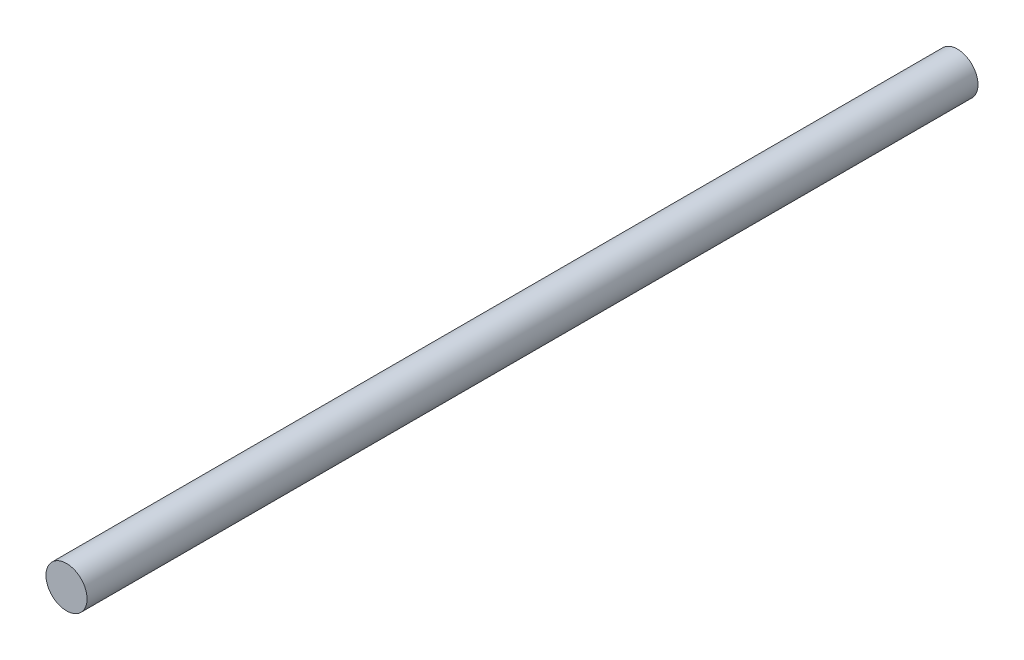
ISO-10303-21;
HEADER;
FILE_DESCRIPTION(('STEP AP214'),'2;1');
FILE_NAME('part.step','',(''),(''),'','','');
FILE_SCHEMA(('AUTOMOTIVE_DESIGN { 1 0 10303 214 1 1 1 1 }'));
ENDSEC;
DATA;
#1=APPLICATION_CONTEXT('core data for automotive mechanical design processes');
#2=APPLICATION_PROTOCOL_DEFINITION('international standard','automotive_design',2000,#1);
#3=PRODUCT_CONTEXT('',#1,'mechanical');
#4=PRODUCT('Part','Part','',(#3));
#5=PRODUCT_RELATED_PRODUCT_CATEGORY('part','',(#4));
#6=PRODUCT_DEFINITION_FORMATION('','',#4);
#7=PRODUCT_DEFINITION_CONTEXT('part definition',#1,'design');
#8=PRODUCT_DEFINITION('design','',#6,#7);
#9=PRODUCT_DEFINITION_SHAPE('','',#8);
#10=(LENGTH_UNIT() NAMED_UNIT(*) SI_UNIT(.MILLI.,.METRE.));
#11=(NAMED_UNIT(*) PLANE_ANGLE_UNIT() SI_UNIT($,.RADIAN.));
#12=(NAMED_UNIT(*) SI_UNIT($,.STERADIAN.) SOLID_ANGLE_UNIT());
#13=UNCERTAINTY_MEASURE_WITH_UNIT(LENGTH_MEASURE(1.E-05),#10,'distance_accuracy_value','');
#14=(GEOMETRIC_REPRESENTATION_CONTEXT(3) GLOBAL_UNCERTAINTY_ASSIGNED_CONTEXT((#13)) GLOBAL_UNIT_ASSIGNED_CONTEXT((#10,
#11,#12)) REPRESENTATION_CONTEXT('',''));
#15=CARTESIAN_POINT('',(0.,0.,0.));
#16=DIRECTION('',(0.,0.,1.));
#17=DIRECTION('',(1.,0.,0.));
#18=AXIS2_PLACEMENT_3D('',#15,#16,#17);
#19=CARTESIAN_POINT('',(0.,0.,330.2));
#20=DIRECTION('',(0.,0.,-1.));
#21=DIRECTION('',(-1.,0.,0.));
#22=AXIS2_PLACEMENT_3D('',#19,#20,#21);
#23=CYLINDRICAL_SURFACE('',#22,7.62);
#24=CARTESIAN_POINT('',(0.,0.,330.2));
#25=DIRECTION('',(0.,0.,1.));
#26=DIRECTION('',(1.,0.,0.));
#27=AXIS2_PLACEMENT_3D('',#24,#25,#26);
#28=CIRCLE('',#27,7.62);
#29=CARTESIAN_POINT('',(7.62,0.,330.2));
#30=VERTEX_POINT('',#29);
#31=EDGE_CURVE('E12',#30,#30,#28,.T.);
#32=ORIENTED_EDGE('',*,*,#31,.F.);
#33=EDGE_LOOP('',(#32));
#34=FACE_BOUND('',#33,.T.);
#35=CARTESIAN_POINT('',(0.,0.,0.));
#36=DIRECTION('',(0.,0.,1.));
#37=DIRECTION('',(1.,0.,0.));
#38=AXIS2_PLACEMENT_3D('',#35,#36,#37);
#39=CIRCLE('',#38,7.62);
#40=CARTESIAN_POINT('',(7.62,0.,0.));
#41=VERTEX_POINT('',#40);
#42=EDGE_CURVE('E44',#41,#41,#39,.T.);
#43=ORIENTED_EDGE('',*,*,#42,.T.);
#44=EDGE_LOOP('',(#43));
#45=FACE_BOUND('',#44,.T.);
#46=ADVANCED_FACE('F41',(#34,#45),#23,.T.);
#47=CARTESIAN_POINT('',(0.,0.,330.2));
#48=DIRECTION('',(0.,0.,1.));
#49=DIRECTION('',(1.,0.,0.));
#50=AXIS2_PLACEMENT_3D('',#47,#48,#49);
#51=PLANE('',#50);
#52=ORIENTED_EDGE('',*,*,#31,.T.);
#53=EDGE_LOOP('',(#52));
#54=FACE_BOUND('',#53,.T.);
#55=ADVANCED_FACE('F56',(#54),#51,.T.);
#56=CARTESIAN_POINT('',(0.,0.,0.));
#57=DIRECTION('',(0.,0.,1.));
#58=DIRECTION('',(1.,0.,0.));
#59=AXIS2_PLACEMENT_3D('',#56,#57,#58);
#60=PLANE('',#59);
#61=ORIENTED_EDGE('',*,*,#42,.F.);
#62=EDGE_LOOP('',(#61));
#63=FACE_BOUND('',#62,.T.);
#64=ADVANCED_FACE('F54',(#63),#60,.F.);
#65=CLOSED_SHELL('',(#46,#55,#64));
#66=MANIFOLD_SOLID_BREP('B2',#65);
#67=ADVANCED_BREP_SHAPE_REPRESENTATION('',(#18,#66),#14);
#68=SHAPE_DEFINITION_REPRESENTATION(#9,#67);
ENDSEC;
END-ISO-10303-21;
